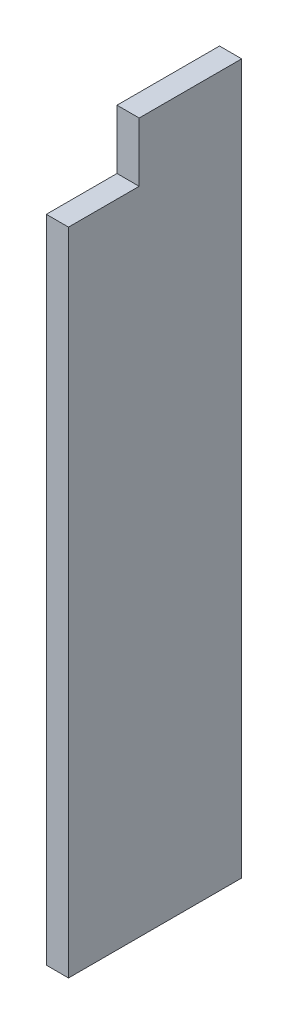
ISO-10303-21;
HEADER;
FILE_DESCRIPTION(('STEP AP214'),'2;1');
FILE_NAME('part.step','',(''),(''),'','','');
FILE_SCHEMA(('AUTOMOTIVE_DESIGN { 1 0 10303 214 1 1 1 1 }'));
ENDSEC;
DATA;
#1=APPLICATION_CONTEXT('core data for automotive mechanical design processes');
#2=APPLICATION_PROTOCOL_DEFINITION('international standard','automotive_design',2000,#1);
#3=PRODUCT_CONTEXT('',#1,'mechanical');
#4=PRODUCT('Part','Part','',(#3));
#5=PRODUCT_RELATED_PRODUCT_CATEGORY('part','',(#4));
#6=PRODUCT_DEFINITION_FORMATION('','',#4);
#7=PRODUCT_DEFINITION_CONTEXT('part definition',#1,'design');
#8=PRODUCT_DEFINITION('design','',#6,#7);
#9=PRODUCT_DEFINITION_SHAPE('','',#8);
#10=(LENGTH_UNIT() NAMED_UNIT(*) SI_UNIT(.MILLI.,.METRE.));
#11=(NAMED_UNIT(*) PLANE_ANGLE_UNIT() SI_UNIT($,.RADIAN.));
#12=(NAMED_UNIT(*) SI_UNIT($,.STERADIAN.) SOLID_ANGLE_UNIT());
#13=UNCERTAINTY_MEASURE_WITH_UNIT(LENGTH_MEASURE(1.E-05),#10,'distance_accuracy_value','');
#14=(GEOMETRIC_REPRESENTATION_CONTEXT(3) GLOBAL_UNCERTAINTY_ASSIGNED_CONTEXT((#13)) GLOBAL_UNIT_ASSIGNED_CONTEXT((#10,
#11,#12)) REPRESENTATION_CONTEXT('',''));
#15=CARTESIAN_POINT('',(0.,0.,0.));
#16=DIRECTION('',(0.,0.,1.));
#17=DIRECTION('',(1.,0.,0.));
#18=AXIS2_PLACEMENT_3D('',#15,#16,#17);
#19=CARTESIAN_POINT('',(25.9999999999999,692.184964261409,-32.9792719707029));
#20=DIRECTION('',(0.,0.,1.));
#21=DIRECTION('',(1.,0.,0.));
#22=AXIS2_PLACEMENT_3D('',#19,#20,#21);
#23=PLANE('',#22);
#24=DIRECTION('',(0.,1.,0.));
#25=VECTOR('',#24,1.);
#26=CARTESIAN_POINT('',(0.,692.184964261409,-32.9792719707029));
#27=LINE('',#26,#25);
#28=CARTESIAN_POINT('',(0.,-52.0111154536388,-32.979271970703));
#29=VERTEX_POINT('',#28);
#30=CARTESIAN_POINT('',(0.,779.414233093263,-32.9792719707029));
#31=VERTEX_POINT('',#30);
#32=EDGE_CURVE('E79',#29,#31,#27,.T.);
#33=ORIENTED_EDGE('',*,*,#32,.T.);
#34=DIRECTION('',(-1.,0.,0.));
#35=VECTOR('',#34,1.);
#36=CARTESIAN_POINT('',(25.9999999999999,779.414233093263,-32.9792719707029));
#37=LINE('',#36,#35);
#38=CARTESIAN_POINT('',(25.9999999999999,779.414233093263,-32.9792719707029));
#39=VERTEX_POINT('',#38);
#40=EDGE_CURVE('E11',#39,#31,#37,.T.);
#41=ORIENTED_EDGE('',*,*,#40,.F.);
#42=DIRECTION('',(0.,1.,0.));
#43=VECTOR('',#42,1.);
#44=CARTESIAN_POINT('',(25.9999999999999,692.184964261409,-32.9792719707029));
#45=LINE('',#44,#43);
#46=CARTESIAN_POINT('',(25.9999999999999,-52.0111154536388,-32.979271970703));
#47=VERTEX_POINT('',#46);
#48=EDGE_CURVE('E85',#47,#39,#45,.T.);
#49=ORIENTED_EDGE('',*,*,#48,.F.);
#50=DIRECTION('',(-1.,0.,0.));
#51=VECTOR('',#50,1.);
#52=CARTESIAN_POINT('',(25.9999999999999,-52.0111154536388,-32.979271970703));
#53=LINE('',#52,#51);
#54=EDGE_CURVE('E113',#47,#29,#53,.T.);
#55=ORIENTED_EDGE('',*,*,#54,.T.);
#56=EDGE_LOOP('',(#33,#41,#49,#55));
#57=FACE_BOUND('',#56,.T.);
#58=ADVANCED_FACE('F33',(#57),#23,.F.);
#59=CARTESIAN_POINT('',(25.9999999999999,779.414233093263,-32.9792719707029));
#60=DIRECTION('',(0.,-1.,0.));
#61=DIRECTION('',(0.,0.,-1.));
#62=AXIS2_PLACEMENT_3D('',#59,#60,#61);
#63=PLANE('',#62);
#64=DIRECTION('',(0.,0.,1.));
#65=VECTOR('',#64,1.);
#66=CARTESIAN_POINT('',(0.,779.414233093263,-32.9792719707029));
#67=LINE('',#66,#65);
#68=CARTESIAN_POINT('',(0.,779.414233093263,87.1554467931475));
#69=VERTEX_POINT('',#68);
#70=EDGE_CURVE('E118',#31,#69,#67,.T.);
#71=ORIENTED_EDGE('',*,*,#70,.T.);
#72=DIRECTION('',(-1.,0.,0.));
#73=VECTOR('',#72,1.);
#74=CARTESIAN_POINT('',(25.9999999999999,779.414233093263,87.1554467931475));
#75=LINE('',#74,#73);
#76=CARTESIAN_POINT('',(25.9999999999999,779.414233093263,87.1554467931475));
#77=VERTEX_POINT('',#76);
#78=EDGE_CURVE('E41',#77,#69,#75,.T.);
#79=ORIENTED_EDGE('',*,*,#78,.F.);
#80=DIRECTION('',(0.,0.,1.));
#81=VECTOR('',#80,1.);
#82=CARTESIAN_POINT('',(25.9999999999999,779.414233093263,-32.9792719707029));
#83=LINE('',#82,#81);
#84=EDGE_CURVE('E140',#39,#77,#83,.T.);
#85=ORIENTED_EDGE('',*,*,#84,.F.);
#86=ORIENTED_EDGE('',*,*,#40,.T.);
#87=EDGE_LOOP('',(#71,#79,#85,#86));
#88=FACE_BOUND('',#87,.T.);
#89=ADVANCED_FACE('F143',(#88),#63,.F.);
#90=CARTESIAN_POINT('',(25.9999999999999,779.414233093263,87.1554467931475));
#91=DIRECTION('',(0.,0.,-1.));
#92=DIRECTION('',(-1.,0.,0.));
#93=AXIS2_PLACEMENT_3D('',#90,#91,#92);
#94=PLANE('',#93);
#95=DIRECTION('',(0.,-1.,0.));
#96=VECTOR('',#95,1.);
#97=CARTESIAN_POINT('',(0.,779.414233093263,87.1554467931475));
#98=LINE('',#97,#96);
#99=CARTESIAN_POINT('',(0.,710.085632065395,87.1554467931475));
#100=VERTEX_POINT('',#99);
#101=EDGE_CURVE('E120',#69,#100,#98,.T.);
#102=ORIENTED_EDGE('',*,*,#101,.T.);
#103=DIRECTION('',(-1.,0.,0.));
#104=VECTOR('',#103,1.);
#105=CARTESIAN_POINT('',(25.9999999999999,710.085632065395,87.1554467931475));
#106=LINE('',#105,#104);
#107=CARTESIAN_POINT('',(25.9999999999999,710.085632065395,87.1554467931475));
#108=VERTEX_POINT('',#107);
#109=EDGE_CURVE('E108',#108,#100,#106,.T.);
#110=ORIENTED_EDGE('',*,*,#109,.F.);
#111=DIRECTION('',(0.,-1.,0.));
#112=VECTOR('',#111,1.);
#113=CARTESIAN_POINT('',(25.9999999999999,779.414233093263,87.1554467931475));
#114=LINE('',#113,#112);
#115=EDGE_CURVE('E99',#77,#108,#114,.T.);
#116=ORIENTED_EDGE('',*,*,#115,.F.);
#117=ORIENTED_EDGE('',*,*,#78,.T.);
#118=EDGE_LOOP('',(#102,#110,#116,#117));
#119=FACE_BOUND('',#118,.T.);
#120=ADVANCED_FACE('F133',(#119),#94,.F.);
#121=CARTESIAN_POINT('',(25.9999999999999,710.085632065395,87.1554467931475));
#122=DIRECTION('',(0.,-1.,0.));
#123=DIRECTION('',(0.,0.,-1.));
#124=AXIS2_PLACEMENT_3D('',#121,#122,#123);
#125=PLANE('',#124);
#126=DIRECTION('',(0.,0.,1.));
#127=VECTOR('',#126,1.);
#128=CARTESIAN_POINT('',(0.,710.085632065395,87.1554467931475));
#129=LINE('',#128,#127);
#130=CARTESIAN_POINT('',(0.,710.085632065395,169.966048388858));
#131=VERTEX_POINT('',#130);
#132=EDGE_CURVE('E107',#100,#131,#129,.T.);
#133=ORIENTED_EDGE('',*,*,#132,.T.);
#134=DIRECTION('',(-1.,0.,0.));
#135=VECTOR('',#134,1.);
#136=CARTESIAN_POINT('',(25.9999999999999,710.085632065395,169.966048388858));
#137=LINE('',#136,#135);
#138=CARTESIAN_POINT('',(25.9999999999999,710.085632065395,169.966048388858));
#139=VERTEX_POINT('',#138);
#140=EDGE_CURVE('E104',#139,#131,#137,.T.);
#141=ORIENTED_EDGE('',*,*,#140,.F.);
#142=DIRECTION('',(0.,0.,1.));
#143=VECTOR('',#142,1.);
#144=CARTESIAN_POINT('',(25.9999999999999,710.085632065395,87.1554467931475));
#145=LINE('',#144,#143);
#146=EDGE_CURVE('E93',#108,#139,#145,.T.);
#147=ORIENTED_EDGE('',*,*,#146,.F.);
#148=ORIENTED_EDGE('',*,*,#109,.T.);
#149=EDGE_LOOP('',(#133,#141,#147,#148));
#150=FACE_BOUND('',#149,.T.);
#151=ADVANCED_FACE('F105',(#150),#125,.F.);
#152=CARTESIAN_POINT('',(25.9999999999999,710.085632065395,169.966048388858));
#153=DIRECTION('',(0.,0.,-1.));
#154=DIRECTION('',(-1.,0.,0.));
#155=AXIS2_PLACEMENT_3D('',#152,#153,#154);
#156=PLANE('',#155);
#157=DIRECTION('',(0.,-1.,0.));
#158=VECTOR('',#157,1.);
#159=CARTESIAN_POINT('',(0.,710.085632065395,169.966048388858));
#160=LINE('',#159,#158);
#161=CARTESIAN_POINT('',(0.,-52.0111154536388,169.966048388858));
#162=VERTEX_POINT('',#161);
#163=EDGE_CURVE('E72',#131,#162,#160,.T.);
#164=ORIENTED_EDGE('',*,*,#163,.T.);
#165=DIRECTION('',(-1.,0.,0.));
#166=VECTOR('',#165,1.);
#167=CARTESIAN_POINT('',(25.9999999999999,-52.0111154536388,169.966048388858));
#168=LINE('',#167,#166);
#169=CARTESIAN_POINT('',(25.9999999999999,-52.0111154536388,169.966048388858));
#170=VERTEX_POINT('',#169);
#171=EDGE_CURVE('E109',#170,#162,#168,.T.);
#172=ORIENTED_EDGE('',*,*,#171,.F.);
#173=DIRECTION('',(0.,-1.,0.));
#174=VECTOR('',#173,1.);
#175=CARTESIAN_POINT('',(25.9999999999999,710.085632065395,169.966048388858));
#176=LINE('',#175,#174);
#177=EDGE_CURVE('E97',#139,#170,#176,.T.);
#178=ORIENTED_EDGE('',*,*,#177,.F.);
#179=ORIENTED_EDGE('',*,*,#140,.T.);
#180=EDGE_LOOP('',(#164,#172,#178,#179));
#181=FACE_BOUND('',#180,.T.);
#182=ADVANCED_FACE('F111',(#181),#156,.F.);
#183=CARTESIAN_POINT('',(25.9999999999999,-52.0111154536388,169.966048388858));
#184=DIRECTION('',(0.,1.,0.));
#185=DIRECTION('',(0.,0.,1.));
#186=AXIS2_PLACEMENT_3D('',#183,#184,#185);
#187=PLANE('',#186);
#188=DIRECTION('',(0.,0.,-1.));
#189=VECTOR('',#188,1.);
#190=CARTESIAN_POINT('',(0.,-52.0111154536388,169.966048388858));
#191=LINE('',#190,#189);
#192=EDGE_CURVE('E124',#162,#29,#191,.T.);
#193=ORIENTED_EDGE('',*,*,#192,.T.);
#194=ORIENTED_EDGE('',*,*,#54,.F.);
#195=DIRECTION('',(0.,0.,-1.));
#196=VECTOR('',#195,1.);
#197=CARTESIAN_POINT('',(25.9999999999999,-52.0111154536388,169.966048388858));
#198=LINE('',#197,#196);
#199=EDGE_CURVE('E49',#170,#47,#198,.T.);
#200=ORIENTED_EDGE('',*,*,#199,.F.);
#201=ORIENTED_EDGE('',*,*,#171,.T.);
#202=EDGE_LOOP('',(#193,#194,#200,#201));
#203=FACE_BOUND('',#202,.T.);
#204=ADVANCED_FACE('F138',(#203),#187,.F.);
#205=CARTESIAN_POINT('',(25.9999999999999,0.,0.));
#206=DIRECTION('',(1.,0.,0.));
#207=DIRECTION('',(0.,0.,-1.));
#208=AXIS2_PLACEMENT_3D('',#205,#206,#207);
#209=PLANE('',#208);
#210=ORIENTED_EDGE('',*,*,#48,.T.);
#211=ORIENTED_EDGE('',*,*,#84,.T.);
#212=ORIENTED_EDGE('',*,*,#115,.T.);
#213=ORIENTED_EDGE('',*,*,#146,.T.);
#214=ORIENTED_EDGE('',*,*,#177,.T.);
#215=ORIENTED_EDGE('',*,*,#199,.T.);
#216=EDGE_LOOP('',(#210,#211,#212,#213,#214,#215));
#217=FACE_BOUND('',#216,.T.);
#218=ADVANCED_FACE('F95',(#217),#209,.T.);
#219=CARTESIAN_POINT('',(0.,0.,0.));
#220=DIRECTION('',(1.,0.,0.));
#221=DIRECTION('',(0.,0.,-1.));
#222=AXIS2_PLACEMENT_3D('',#219,#220,#221);
#223=PLANE('',#222);
#224=ORIENTED_EDGE('',*,*,#32,.F.);
#225=ORIENTED_EDGE('',*,*,#192,.F.);
#226=ORIENTED_EDGE('',*,*,#163,.F.);
#227=ORIENTED_EDGE('',*,*,#132,.F.);
#228=ORIENTED_EDGE('',*,*,#101,.F.);
#229=ORIENTED_EDGE('',*,*,#70,.F.);
#230=EDGE_LOOP('',(#224,#225,#226,#227,#228,#229));
#231=FACE_BOUND('',#230,.T.);
#232=ADVANCED_FACE('F136',(#231),#223,.F.);
#233=CLOSED_SHELL('',(#58,#89,#120,#151,#182,#204,#218,#232));
#234=MANIFOLD_SOLID_BREP('B2',#233);
#235=ADVANCED_BREP_SHAPE_REPRESENTATION('',(#18,#234),#14);
#236=SHAPE_DEFINITION_REPRESENTATION(#9,#235);
ENDSEC;
END-ISO-10303-21;
